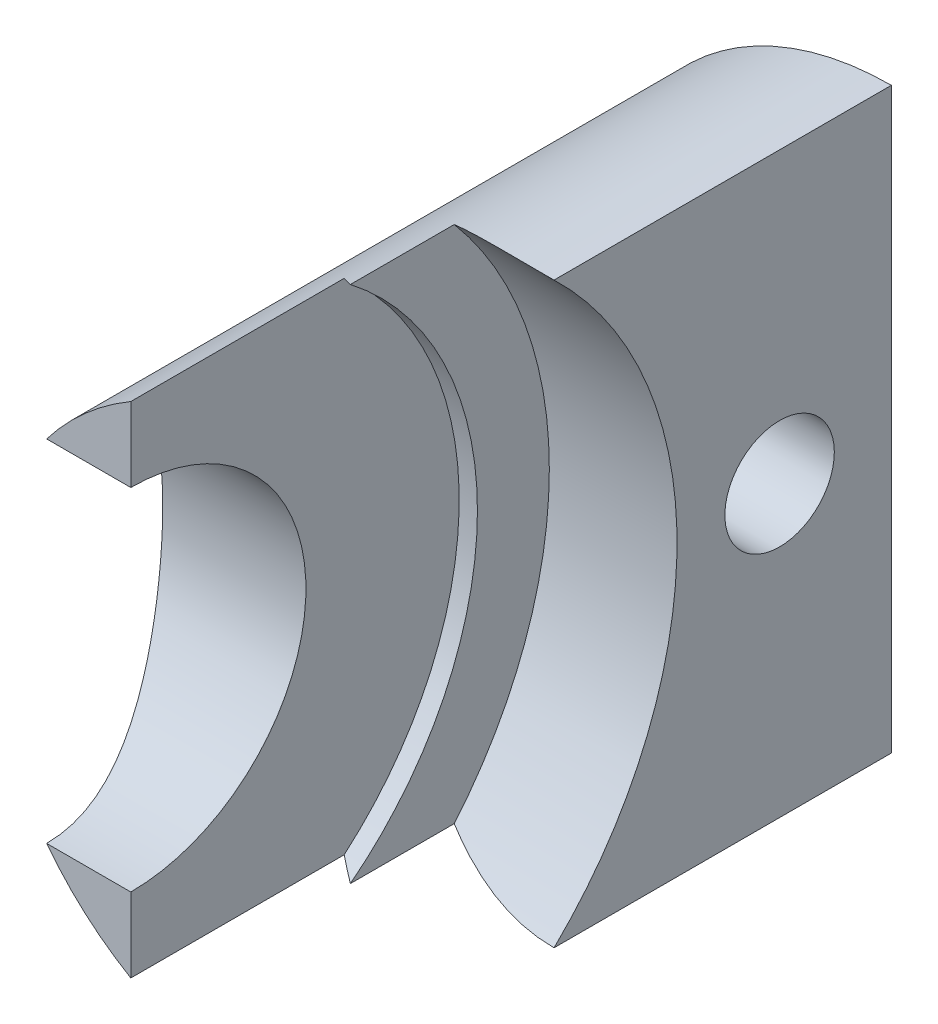
ISO-10303-21;
HEADER;
FILE_DESCRIPTION(('STEP AP214'),'2;1');
FILE_NAME('part.step','',(''),(''),'','','');
FILE_SCHEMA(('AUTOMOTIVE_DESIGN { 1 0 10303 214 1 1 1 1 }'));
ENDSEC;
DATA;
#1=APPLICATION_CONTEXT('core data for automotive mechanical design processes');
#2=APPLICATION_PROTOCOL_DEFINITION('international standard','automotive_design',2000,#1);
#3=PRODUCT_CONTEXT('',#1,'mechanical');
#4=PRODUCT('Part','Part','',(#3));
#5=PRODUCT_RELATED_PRODUCT_CATEGORY('part','',(#4));
#6=PRODUCT_DEFINITION_FORMATION('','',#4);
#7=PRODUCT_DEFINITION_CONTEXT('part definition',#1,'design');
#8=PRODUCT_DEFINITION('design','',#6,#7);
#9=PRODUCT_DEFINITION_SHAPE('','',#8);
#10=(LENGTH_UNIT() NAMED_UNIT(*) SI_UNIT(.MILLI.,.METRE.));
#11=(NAMED_UNIT(*) PLANE_ANGLE_UNIT() SI_UNIT($,.RADIAN.));
#12=(NAMED_UNIT(*) SI_UNIT($,.STERADIAN.) SOLID_ANGLE_UNIT());
#13=UNCERTAINTY_MEASURE_WITH_UNIT(LENGTH_MEASURE(1.E-05),#10,'distance_accuracy_value','');
#14=(GEOMETRIC_REPRESENTATION_CONTEXT(3) GLOBAL_UNCERTAINTY_ASSIGNED_CONTEXT((#13)) GLOBAL_UNIT_ASSIGNED_CONTEXT((#10,
#11,#12)) REPRESENTATION_CONTEXT('',''));
#15=CARTESIAN_POINT('',(0.,0.,0.));
#16=DIRECTION('',(0.,0.,1.));
#17=DIRECTION('',(1.,0.,0.));
#18=AXIS2_PLACEMENT_3D('',#15,#16,#17);
#19=CARTESIAN_POINT('',(0.,0.,16.84375));
#20=DIRECTION('',(0.,0.,1.));
#21=DIRECTION('',(1.,0.,0.));
#22=AXIS2_PLACEMENT_3D('',#19,#20,#21);
#23=PLANE('',#22);
#24=DIRECTION('',(1.,0.,0.));
#25=VECTOR('',#24,1.);
#26=CARTESIAN_POINT('',(-7.925,-4.8,16.84375));
#27=LINE('',#26,#25);
#28=CARTESIAN_POINT('',(-6.30599912781472,-4.8,16.84375));
#29=VERTEX_POINT('',#28);
#30=CARTESIAN_POINT('',(-4.,-4.8,16.84375));
#31=VERTEX_POINT('',#30);
#32=EDGE_CURVE('E99',#29,#31,#27,.T.);
#33=ORIENTED_EDGE('',*,*,#32,.F.);
#34=CARTESIAN_POINT('',(0.,0.,16.84375));
#35=DIRECTION('',(0.,0.,1.));
#36=DIRECTION('',(1.,0.,0.));
#37=AXIS2_PLACEMENT_3D('',#34,#35,#36);
#38=CIRCLE('',#37,7.925);
#39=CARTESIAN_POINT('',(-4.,-6.84146365918873,16.84375));
#40=VERTEX_POINT('',#39);
#41=EDGE_CURVE('E110',#29,#40,#38,.T.);
#42=ORIENTED_EDGE('',*,*,#41,.T.);
#43=DIRECTION('',(0.,1.,0.));
#44=VECTOR('',#43,1.);
#45=CARTESIAN_POINT('',(-4.,0.,16.84375));
#46=LINE('',#45,#44);
#47=EDGE_CURVE('E112',#40,#31,#46,.T.);
#48=ORIENTED_EDGE('',*,*,#47,.T.);
#49=EDGE_LOOP('',(#33,#42,#48));
#50=FACE_BOUND('',#49,.T.);
#51=ADVANCED_FACE('F29',(#50),#23,.T.);
#52=DIRECTION('',(1.,0.,0.));
#53=VECTOR('',#52,1.);
#54=CARTESIAN_POINT('',(-7.925,4.8,16.84375));
#55=LINE('',#54,#53);
#56=CARTESIAN_POINT('',(-4.,4.8,16.84375));
#57=VERTEX_POINT('',#56);
#58=CARTESIAN_POINT('',(-6.30599912781472,4.8,16.84375));
#59=VERTEX_POINT('',#58);
#60=EDGE_CURVE('E102',#57,#59,#55,.F.);
#61=ORIENTED_EDGE('',*,*,#60,.F.);
#62=CARTESIAN_POINT('',(-4.,6.84146365918873,16.84375));
#63=VERTEX_POINT('',#62);
#64=EDGE_CURVE('E212',#57,#63,#46,.T.);
#65=ORIENTED_EDGE('',*,*,#64,.T.);
#66=EDGE_CURVE('E117',#63,#59,#38,.T.);
#67=ORIENTED_EDGE('',*,*,#66,.T.);
#68=EDGE_LOOP('',(#61,#65,#67));
#69=FACE_BOUND('',#68,.T.);
#70=ADVANCED_FACE('F183',(#69),#23,.T.);
#71=CARTESIAN_POINT('',(0.,0.,16.84375));
#72=DIRECTION('',(0.,0.,-1.));
#73=DIRECTION('',(-1.,0.,0.));
#74=AXIS2_PLACEMENT_3D('',#71,#72,#73);
#75=CYLINDRICAL_SURFACE('',#74,7.925);
#76=CARTESIAN_POINT('',(-7.925,0.,1.5625));
#77=CARTESIAN_POINT('',(-7.92499848371948,0.0834570395977829,1.56250317336691));
#78=CARTESIAN_POINT('',(-7.92366808859329,0.166955202672544,1.569488613297));
#79=CARTESIAN_POINT('',(-7.91848912344264,0.331597599956485,1.59722723564836));
#80=CARTESIAN_POINT('',(-7.91463844543031,0.41273980423412,1.61799194337844));
#81=CARTESIAN_POINT('',(-7.90484955579841,0.570265475447111,1.67262970705467));
#82=CARTESIAN_POINT('',(-7.89891324575618,0.646653202850343,1.70649082516074));
#83=CARTESIAN_POINT('',(-7.88560092752527,0.792656462406949,1.7863261099215));
#84=CARTESIAN_POINT('',(-7.87822503160065,0.862272522005299,1.83229933212873));
#85=CARTESIAN_POINT('',(-7.86274678235363,0.993611905934744,1.93564873711105));
#86=CARTESIAN_POINT('',(-7.85463737509997,1.05524073071637,1.99314396847609));
#87=CARTESIAN_POINT('',(-7.83865829437125,1.16803861203772,2.11764924864934));
#88=CARTESIAN_POINT('',(-7.83078863835487,1.21920690838369,2.18465998837499));
#89=CARTESIAN_POINT('',(-7.81611148057603,1.31002556993215,2.32696357924578));
#90=CARTESIAN_POINT('',(-7.80931307109212,1.34957956815894,2.4023189525069));
#91=CARTESIAN_POINT('',(-7.7976476449595,1.41542987431425,2.55875545566025));
#92=CARTESIAN_POINT('',(-7.79278045843732,1.44172734836295,2.63983608121074));
#93=CARTESIAN_POINT('',(-7.78559960520081,1.48001435057426,2.80440959467139));
#94=CARTESIAN_POINT('',(-7.78325652573322,1.49216882030728,2.88786280105138));
#95=CARTESIAN_POINT('',(-7.78130052045626,1.5023368114327,3.0556543575816));
#96=CARTESIAN_POINT('',(-7.78168734509969,1.50035162536534,3.1399926261224));
#97=CARTESIAN_POINT('',(-7.78512067069891,1.48243034962562,3.30596364573442));
#98=CARTESIAN_POINT('',(-7.78813137294877,1.46668202838643,3.38761752180427));
#99=CARTESIAN_POINT('',(-7.79641697404718,1.42197732018187,3.54710290402796));
#100=CARTESIAN_POINT('',(-7.80169197076541,1.39302036229574,3.62493424479815));
#101=CARTESIAN_POINT('',(-7.81394911022026,1.32253733306208,3.77511346618336));
#102=CARTESIAN_POINT('',(-7.82094147446446,1.28093563638314,3.84742498514177));
#103=CARTESIAN_POINT('',(-7.83583875379596,1.18639751632359,3.98411159924889));
#104=CARTESIAN_POINT('',(-7.8437437631594,1.13345992146228,4.04848587305811));
#105=CARTESIAN_POINT('',(-7.85973149746342,1.01674131650945,4.16855532872357));
#106=CARTESIAN_POINT('',(-7.86781503708303,0.952799749716239,4.22409444394866));
#107=CARTESIAN_POINT('',(-7.88313235527213,0.816425008558438,4.32368159908748));
#108=CARTESIAN_POINT('',(-7.89036612501102,0.743991745965808,4.36772951959327));
#109=CARTESIAN_POINT('',(-7.90318387876219,0.59252547032848,4.44310773156422));
#110=CARTESIAN_POINT('',(-7.9087657257274,0.513484076496507,4.47442156870695));
#111=CARTESIAN_POINT('',(-7.91763423900561,0.351133850096447,4.52328374883041));
#112=CARTESIAN_POINT('',(-7.92092115384422,0.267825480662051,4.54083358238499));
#113=CARTESIAN_POINT('',(-7.92479525353875,0.100648603971151,4.56145183587511));
#114=CARTESIAN_POINT('',(-7.9254222930723,0.0168073588889621,4.56473405559083));
#115=CARTESIAN_POINT('',(-7.92401616684636,-0.150225893266153,4.55729772514609));
#116=CARTESIAN_POINT('',(-7.92198313437726,-0.23341793265924,4.54657987649854));
#117=CARTESIAN_POINT('',(-7.91551013384104,-0.39611151113508,4.51162538443318));
#118=CARTESIAN_POINT('',(-7.91108947226885,-0.475637173331645,4.48749713338365));
#119=CARTESIAN_POINT('',(-7.90033487933066,-0.629514388963665,4.42652420474412));
#120=CARTESIAN_POINT('',(-7.89400081614994,-0.703865585494564,4.38967865103103));
#121=CARTESIAN_POINT('',(-7.88002261530286,-0.846194267061441,4.30384530261995));
#122=CARTESIAN_POINT('',(-7.87236470232106,-0.91409174763786,4.2547271341029));
#123=CARTESIAN_POINT('',(-7.85662335616311,-1.04075726435733,4.14591900283076));
#124=CARTESIAN_POINT('',(-7.84853988249625,-1.0995244296714,4.08622803282614));
#125=CARTESIAN_POINT('',(-7.83272595988502,-1.20707530089407,3.95700003853142));
#126=CARTESIAN_POINT('',(-7.82500177669041,-1.25571297919608,3.88734058667665));
#127=CARTESIAN_POINT('',(-7.81090801252659,-1.34059691554051,3.74071461209814));
#128=CARTESIAN_POINT('',(-7.80453838063785,-1.37684363940793,3.66374836420479));
#129=CARTESIAN_POINT('',(-7.79392428679271,-1.43571078202909,3.50506091402016));
#130=CARTESIAN_POINT('',(-7.78966948499935,-1.45839761048839,3.42336507127201));
#131=CARTESIAN_POINT('',(-7.78374340795502,-1.48970531945365,3.25723290828082));
#132=CARTESIAN_POINT('',(-7.78207183502654,-1.498327820664,3.17279690494434));
#133=CARTESIAN_POINT('',(-7.78151677430078,-1.50120708268881,3.0050444351122));
#134=CARTESIAN_POINT('',(-7.78258857056606,-1.4956942419548,2.92173198420293));
#135=CARTESIAN_POINT('',(-7.78730022630365,-1.47096429407233,2.75724432738762));
#136=CARTESIAN_POINT('',(-7.7909400697357,-1.45174727252152,2.67606910813552));
#137=CARTESIAN_POINT('',(-7.800358708229,-1.40025245426932,2.51828725434834));
#138=CARTESIAN_POINT('',(-7.80613334053562,-1.36800006468281,2.44167206327842));
#139=CARTESIAN_POINT('',(-7.8191737643007,-1.29137540467831,2.29490360923344));
#140=CARTESIAN_POINT('',(-7.82643966385813,-1.24700225557352,2.22475081523901));
#141=CARTESIAN_POINT('',(-7.84178246925031,-1.14659661646438,2.09174537552434));
#142=CARTESIAN_POINT('',(-7.84987005399919,-1.09039662628069,2.02902038549518));
#143=CARTESIAN_POINT('',(-7.86586552302267,-0.968281413042159,1.91381446708884));
#144=CARTESIAN_POINT('',(-7.87377336559303,-0.902363961347241,1.8613358950994));
#145=CARTESIAN_POINT('',(-7.88860376027912,-0.761958024020439,1.76766070972676));
#146=CARTESIAN_POINT('',(-7.89551657723058,-0.68739625650139,1.72657234484605));
#147=CARTESIAN_POINT('',(-7.90748287021571,-0.532320313335581,1.65757167407056));
#148=CARTESIAN_POINT('',(-7.91253808199661,-0.451811779284627,1.62964706102112));
#149=CARTESIAN_POINT('',(-7.91919564162046,-0.309228461225967,1.59340037484214));
#150=CARTESIAN_POINT('',(-7.92135992219509,-0.247984316003027,1.58183265565595));
#151=CARTESIAN_POINT('',(-7.92426264826391,-0.124501059104401,1.56638138540379));
#152=CARTESIAN_POINT('',(-7.92500113120017,-0.0622619735995683,1.56249763255338));
#153=CARTESIAN_POINT('',(-7.925,0.,1.5625));
#154=B_SPLINE_CURVE_WITH_KNOTS('',3,(#76,#77,#78,#79,#80,#81,#82,#83,#84,#85,#86,#87,#88,#89,
#90,#91,#92,#93,#94,#95,#96,#97,#98,#99,#100,#101,#102,#103,#104,#105,#106,#107,#108,#109,#110,
#111,#112,#113,#114,#115,#116,#117,#118,#119,#120,#121,#122,#123,#124,#125,#126,#127,#128,#129,
#130,#131,#132,#133,#134,#135,#136,#137,#138,#139,#140,#141,#142,#143,#144,#145,#146,#147,#148,
#149,#150,#151,#152,#153),.UNSPECIFIED.,.T.,.F.,(4,2,2,2,2,2,2,2,2,2,2,2,2,2,2,2,2,2,2,2,2,2,2,
2,2,2,2,2,2,2,2,2,2,2,2,2,2,2,4),(0.,0.250143412147268,0.500496314385551,0.750621546920509,
1.000727281583,1.25356442104396,1.50641992830943,1.76131771944112,2.01619308438141,
2.26806521265155,2.5199143169749,2.76838019331623,3.01685681018847,3.26684976961555,
3.5168685764329,3.77090447122562,4.02494300566498,4.27930876041063,4.53364696479179,
4.78416048544787,5.03466145389883,5.28316653775695,5.53168874509808,5.78297250484537,
6.03428021677975,6.2889923217932,6.54369485011736,6.79713952595101,7.05055499399412,
7.29986627658862,7.54917600197427,7.79800212559833,8.04684629250405,8.29948568937352,
8.55218311793758,8.80720562481341,9.06198922891165,9.2486101731229,9.43522621651815),.UNSPECIFIED.);
#155=CARTESIAN_POINT('',(-7.925,0.,1.5625));
#156=VERTEX_POINT('',#155);
#157=EDGE_CURVE('E11',#156,#156,#154,.T.);
#158=ORIENTED_EDGE('',*,*,#157,.T.);
#159=EDGE_LOOP('',(#158));
#160=FACE_BOUND('',#159,.T.);
#161=CARTESIAN_POINT('',(-7.925,0.,12.04375));
#162=CARTESIAN_POINT('',(-7.92499911315988,0.122642132325654,12.0437509451502));
#163=CARTESIAN_POINT('',(-7.92214605061424,0.245309757695014,12.048457468869));
#164=CARTESIAN_POINT('',(-7.91080176542962,0.489716410169184,12.0672226130683));
#165=CARTESIAN_POINT('',(-7.90230743457521,0.611454887910784,12.081286389198));
#166=CARTESIAN_POINT('',(-7.87987239085095,0.853229392606028,12.1186059032133));
#167=CARTESIAN_POINT('',(-7.86592194440194,0.973261977462213,12.1418780695189));
#168=CARTESIAN_POINT('',(-7.83290995311438,1.21058258209677,12.197316044084));
#169=CARTESIAN_POINT('',(-7.81384622447643,1.32786940588064,12.2294856524794));
#170=CARTESIAN_POINT('',(-7.771169731088,1.55826609284085,12.3021297725829));
#171=CARTESIAN_POINT('',(-7.74758225969132,1.67139519702797,12.3425581855678));
#172=CARTESIAN_POINT('',(-7.69630941745201,1.89353255576294,12.4313964967494));
#173=CARTESIAN_POINT('',(-7.66862248310299,2.00253921803876,12.4798094409961));
#174=CARTESIAN_POINT('',(-7.58029693661135,2.32239330370474,12.6362879960332));
#175=CARTESIAN_POINT('',(-7.51433898906773,2.52635788004552,12.7556838208614));
#176=CARTESIAN_POINT('',(-7.36785764554834,2.92735544742974,13.0313506844277));
#177=CARTESIAN_POINT('',(-7.28660261980323,3.12263530068096,13.1897580717416));
#178=CARTESIAN_POINT('',(-7.12012718893669,3.48558959734203,13.5341678602906));
#179=CARTESIAN_POINT('',(-7.03490174428135,3.65322765995492,13.7202060256481));
#180=CARTESIAN_POINT('',(-6.85738853007434,3.97744960551398,14.1420244739208));
#181=CARTESIAN_POINT('',(-6.76555651276965,4.13000676725935,14.381117192179));
#182=CARTESIAN_POINT('',(-6.59834752799913,4.3922328686223,14.8869447715862));
#183=CARTESIAN_POINT('',(-6.52294366352691,4.50197214846326,15.1536333789816));
#184=CARTESIAN_POINT('',(-6.41654930674811,4.65186075991639,15.6403537170865));
#185=CARTESIAN_POINT('',(-6.3791997657275,4.70248078328413,15.8557643184318));
#186=CARTESIAN_POINT('',(-6.32619657490561,4.77356288645936,16.294011159372));
#187=CARTESIAN_POINT('',(-6.31051515077192,4.79406357556202,16.5168375172936));
#188=CARTESIAN_POINT('',(-6.30317543203658,4.8037127264102,16.9640462266006));
#189=CARTESIAN_POINT('',(-6.31156758300809,4.7927953522377,17.1884308610486));
#190=CARTESIAN_POINT('',(-6.35117377933606,4.74017276336672,17.6315526992633));
#191=CARTESIAN_POINT('',(-6.38240526480788,4.69844402087211,17.8502854550342));
#192=CARTESIAN_POINT('',(-6.46272125856956,4.587310012476,18.2733551079764));
#193=CARTESIAN_POINT('',(-6.51153091472183,4.51832932913485,18.4778587405431));
#194=CARTESIAN_POINT('',(-6.62171015383229,4.35525388254881,18.8729077004704));
#195=CARTESIAN_POINT('',(-6.68308429899309,4.26114999320963,19.0634479234529));
#196=CARTESIAN_POINT('',(-6.82464147519828,4.03127557803615,19.4611062627211));
#197=CARTESIAN_POINT('',(-6.90622901385975,3.89107297925623,19.6651568979971));
#198=CARTESIAN_POINT('',(-7.07174819067398,3.58145358305864,20.0490625054903));
#199=CARTESIAN_POINT('',(-7.15568204515047,3.41200832399074,20.2288935985554));
#200=CARTESIAN_POINT('',(-7.28395502440243,3.12455124141532,20.4902849471716));
#201=CARTESIAN_POINT('',(-7.32990086041053,3.01546242268114,20.5810241793141));
#202=CARTESIAN_POINT('',(-7.41903347368405,2.78897002376119,20.7529497783605));
#203=CARTESIAN_POINT('',(-7.46222130613232,2.67156966017453,20.8341398088165));
#204=CARTESIAN_POINT('',(-7.54467462745826,2.42897682652577,20.9862825159124));
#205=CARTESIAN_POINT('',(-7.58393950792854,2.30378315267717,21.0572336053592));
#206=CARTESIAN_POINT('',(-7.65739944252727,2.04639925905587,21.1880647681574));
#207=CARTESIAN_POINT('',(-7.6915976206669,1.91421341930147,21.2479516691051));
#208=CARTESIAN_POINT('',(-7.75201570538621,1.65192992849052,21.3526117714748));
#209=CARTESIAN_POINT('',(-7.77859414594751,1.52219349586455,21.3980822460144));
#210=CARTESIAN_POINT('',(-7.82560959482879,1.25833264678613,21.4779254882188));
#211=CARTESIAN_POINT('',(-7.84605006547379,1.12421075162769,21.5123045131999));
#212=CARTESIAN_POINT('',(-7.88017166955357,0.852769256652923,21.5694251017779));
#213=CARTESIAN_POINT('',(-7.89385799055088,0.715452196056142,21.5921755972135));
#214=CARTESIAN_POINT('',(-7.91405447631498,0.438845617699454,21.6256757373104));
#215=CARTESIAN_POINT('',(-7.92056569646099,0.299556393076937,21.6364271469094));
#216=CARTESIAN_POINT('',(-7.92581175388947,0.0398466955955401,21.6450907721343));
#217=CARTESIAN_POINT('',(-7.92550171427004,-0.0805052961529175,21.6445799228681));
#218=CARTESIAN_POINT('',(-7.91941885946609,-0.320732803360764,21.6345314114327));
#219=CARTESIAN_POINT('',(-7.9136443613749,-0.440608160607944,21.6249909683906));
#220=CARTESIAN_POINT('',(-7.89677096548462,-0.67888601240624,21.597011263222));
#221=CARTESIAN_POINT('',(-7.88567434398708,-0.797289114457855,21.5785758055221));
#222=CARTESIAN_POINT('',(-7.85842832984379,-1.03184483931372,21.5330564621045));
#223=CARTESIAN_POINT('',(-7.84227698911594,-1.14799657608586,21.505969241926));
#224=CARTESIAN_POINT('',(-7.78779420336551,-1.48548202568029,21.4139328142593));
#225=CARTESIAN_POINT('',(-7.74290888525803,-1.70272275454459,21.3373660807301));
#226=CARTESIAN_POINT('',(-7.63893679407907,-2.12106117846169,21.1557387531171));
#227=CARTESIAN_POINT('',(-7.57984732722901,-2.32215580178728,21.0506727537382));
#228=CARTESIAN_POINT('',(-7.44505260367053,-2.72515113814113,20.8029296207868));
#229=CARTESIAN_POINT('',(-7.36826130622406,-2.92498771847969,20.6574878026072));
#230=CARTESIAN_POINT('',(-7.20862847576037,-3.29890049865134,20.3391308657971));
#231=CARTESIAN_POINT('',(-7.12578000105746,-3.47294642810157,20.1661839502572));
#232=CARTESIAN_POINT('',(-6.9496605911384,-3.81437387271958,19.7707991822563));
#233=CARTESIAN_POINT('',(-6.85647895076537,-3.97774498700513,19.5448354425571));
#234=CARTESIAN_POINT('',(-6.68194810038016,-4.26443269225748,19.0647075583233));
#235=CARTESIAN_POINT('',(-6.60058733144386,-4.38778855927915,18.8105713966215));
#236=CARTESIAN_POINT('',(-6.47701034335335,-4.56763297882269,18.3358661848459));
#237=CARTESIAN_POINT('',(-6.43013771377633,-4.63279999265059,18.1198502617728));
#238=CARTESIAN_POINT('',(-6.37540904395641,-4.7075155711577,17.7882958642013));
#239=CARTESIAN_POINT('',(-6.3597640585489,-4.72858015782702,17.6765401675925));
#240=CARTESIAN_POINT('',(-6.3342015877038,-4.76277044010843,17.4511903147469));
#241=CARTESIAN_POINT('',(-6.3242818722931,-4.77589922678187,17.3375968920451));
#242=CARTESIAN_POINT('',(-6.31053346237829,-4.79405069242927,17.1088885012323));
#243=CARTESIAN_POINT('',(-6.30673192746871,-4.79903722804926,16.9937690234614));
#244=CARTESIAN_POINT('',(-6.30545894414935,-4.80070971779676,16.7634344608166));
#245=CARTESIAN_POINT('',(-6.3079875008376,-4.79739566523926,16.6482193758658));
#246=CARTESIAN_POINT('',(-6.31927444071069,-4.78251852330518,16.4186002403118));
#247=CARTESIAN_POINT('',(-6.32803439879913,-4.77095334856533,16.3041964021244));
#248=CARTESIAN_POINT('',(-6.35142554240473,-4.73976668740736,16.0770859995299));
#249=CARTESIAN_POINT('',(-6.36605902669665,-4.72014204661376,15.9643801176074));
#250=CARTESIAN_POINT('',(-6.41605639108533,-4.65219763015593,15.6423988470319));
#251=CARTESIAN_POINT('',(-6.45829163128839,-4.59386922537816,15.4362055370014));
#252=CARTESIAN_POINT('',(-6.55697172323092,-4.4518711955014,15.036550250709));
#253=CARTESIAN_POINT('',(-6.61342198191184,-4.36819192527342,14.8430931542987));
#254=CARTESIAN_POINT('',(-6.7446298424366,-4.16323441346624,14.442615581089));
#255=CARTESIAN_POINT('',(-6.82086624447041,-4.03817111850311,14.2380155526884));
#256=CARTESIAN_POINT('',(-6.97800270259854,-3.76014382250235,13.8507091978989));
#257=CARTESIAN_POINT('',(-7.05890658212365,-3.60715671880079,13.6680212093083));
#258=CARTESIAN_POINT('',(-7.23262165495172,-3.24672263596931,13.2974291740149));
#259=CARTESIAN_POINT('',(-7.32509987055307,-3.03443605803739,13.1139875734066));
#260=CARTESIAN_POINT('',(-7.45470130076703,-2.69222153941202,12.867345510498));
#261=CARTESIAN_POINT('',(-7.49641408727295,-2.57407515767851,12.7898310576172));
#262=CARTESIAN_POINT('',(-7.57570261156021,-2.33039201647475,12.645020775318));
#263=CARTESIAN_POINT('',(-7.61328064866461,-2.2048594246794,12.5777192585369));
#264=CARTESIAN_POINT('',(-7.68242553821368,-1.95012330982817,12.4555257579139));
#265=CARTESIAN_POINT('',(-7.71411209461399,-1.82107356842645,12.4003810732903));
#266=CARTESIAN_POINT('',(-7.77160539029867,-1.55754360381442,12.3012997642531));
#267=CARTESIAN_POINT('',(-7.79741555813074,-1.42306660131214,12.257356602571));
#268=CARTESIAN_POINT('',(-7.84231756975939,-1.15011194547419,12.1814271449103));
#269=CARTESIAN_POINT('',(-7.86142871058781,-1.01164704751033,12.1494064884358));
#270=CARTESIAN_POINT('',(-7.89240247857492,-0.731712613708138,12.0977176117172));
#271=CARTESIAN_POINT('',(-7.90427098982073,-0.590245613807051,12.0780393638401));
#272=CARTESIAN_POINT('',(-7.91653876824408,-0.373636633143919,12.0577300765501));
#273=CARTESIAN_POINT('',(-7.91970844032989,-0.299048272265573,12.0524908795744));
#274=CARTESIAN_POINT('',(-7.92393937331244,-0.149643110775774,12.0455004759379));
#275=CARTESIAN_POINT('',(-7.92500054107805,-0.0748263002200344,12.0437494233459));
#276=CARTESIAN_POINT('',(-7.925,0.,12.04375));
#277=B_SPLINE_CURVE_WITH_KNOTS('',3,(#161,#162,#163,#164,#165,#166,#167,#168,#169,#170,#171,
#172,#173,#174,#175,#176,#177,#178,#179,#180,#181,#182,#183,#184,#185,#186,#187,#188,#189,#190,
#191,#192,#193,#194,#195,#196,#197,#198,#199,#200,#201,#202,#203,#204,#205,#206,#207,#208,#209,
#210,#211,#212,#213,#214,#215,#216,#217,#218,#219,#220,#221,#222,#223,#224,#225,#226,#227,#228,
#229,#230,#231,#232,#233,#234,#235,#236,#237,#238,#239,#240,#241,#242,#243,#244,#245,#246,#247,
#248,#249,#250,#251,#252,#253,#254,#255,#256,#257,#258,#259,#260,#261,#262,#263,#264,#265,#266,
#267,#268,#269,#270,#271,#272,#273,#274,#275,#276),.UNSPECIFIED.,.T.,.F.,(4,2,2,2,2,2,2,2,2,2,2,
2,2,2,2,2,2,2,2,2,2,2,2,2,2,2,2,2,2,2,2,2,2,2,2,2,2,2,2,2,2,2,2,2,2,2,2,2,2,2,2,2,2,2,2,2,2,4),
(0.,0.367848111429016,0.735899067453033,1.1046096346776,1.47347792360068,1.84034093139371,
2.20734422030129,2.94045454194068,3.73020719806882,4.52099113227314,5.41100476041229,
6.29955007618031,6.96993639733762,7.63946261332169,8.31039282891834,8.98183590248017,
9.64320626824115,10.3048172068093,11.0839527841129,11.8638510093013,12.3108138380761,
12.7576046262738,13.2044645996738,13.6510478925789,14.0704937153371,14.4897024894139,
14.9085887847781,15.3274134583017,15.6880208588677,16.0487393529983,16.409303703234,
16.7700071859733,17.4708279884298,18.171781804667,18.9451706958693,19.7194602405853,
20.5973912475813,21.4744579155361,22.1626935678251,22.5067070526148,22.8505864547449,
23.1959882240744,23.5413902715786,23.8868796458735,24.2325043695063,24.8849178657193,
25.5375798951369,26.2896259163447,27.0422969839584,27.9238378427924,28.3653608581742,
28.8066370894684,29.2376270167244,29.6683648371035,30.097851487848,30.5269887471171,
30.7514099719681,30.9758411091247),.UNSPECIFIED.);
#278=EDGE_CURVE('E41',#29,#59,#277,.T.);
#279=ORIENTED_EDGE('',*,*,#278,.T.);
#280=ORIENTED_EDGE('',*,*,#66,.F.);
#281=DIRECTION('',(0.,0.,-1.));
#282=VECTOR('',#281,1.);
#283=CARTESIAN_POINT('',(-4.,6.84146365918873,16.84375));
#284=LINE('',#283,#282);
#285=CARTESIAN_POINT('',(-4.,6.84146365918873,10.9961543402438));
#286=VERTEX_POINT('',#285);
#287=EDGE_CURVE('E157',#286,#63,#284,.F.);
#288=ORIENTED_EDGE('',*,*,#287,.F.);
#289=CARTESIAN_POINT('',(-4.,6.84146365918873,10.9961543402438));
#290=CARTESIAN_POINT('',(-3.8710375308379,6.91683585802271,11.0843079100545));
#291=CARTESIAN_POINT('',(-3.73968192012294,6.98877030195516,11.1719485258962));
#292=CARTESIAN_POINT('',(-3.47169431467644,7.1257099619526,11.3449898643057));
#293=CARTESIAN_POINT('',(-3.33505558927621,7.19070591372915,11.4303874801583));
#294=CARTESIAN_POINT('',(-3.05329813139729,7.31486013640419,11.599319174863));
#295=CARTESIAN_POINT('',(-2.90805921616113,7.37385937580257,11.682771475941));
#296=CARTESIAN_POINT('',(-2.61161391782818,7.48399068640011,11.8438087077917));
#297=CARTESIAN_POINT('',(-2.46041056390043,7.53512668808946,11.9213965600206));
#298=CARTESIAN_POINT('',(-2.06543508593223,7.65523996885638,12.1092398186067));
#299=CARTESIAN_POINT('',(-1.81688739321352,7.71835471135747,12.2137084807187));
#300=CARTESIAN_POINT('',(-1.43336981414385,7.79537400284123,12.3454432324662));
#301=CARTESIAN_POINT('',(-1.30435857987584,7.81804130063197,12.3850689928507));
#302=CARTESIAN_POINT('',(-1.0428230364425,7.85720155138219,12.4544503579904));
#303=CARTESIAN_POINT('',(-0.91030121853407,7.8736987635216,12.4842127697443));
#304=CARTESIAN_POINT('',(-0.649200770697978,7.89939554732054,12.5309465641994));
#305=CARTESIAN_POINT('',(-0.520757071312494,7.90891923379852,12.5484839191905));
#306=CARTESIAN_POINT('',(-0.261579471184321,7.92176150231718,12.5722462411869));
#307=CARTESIAN_POINT('',(-0.130835677162662,7.92503397577123,12.5783871392079));
#308=CARTESIAN_POINT('',(0.,7.925,12.5782635095748));
#309=B_SPLINE_CURVE_WITH_KNOTS('',3,(#289,#290,#291,#292,#293,#294,#295,#296,#297,#298,#299,
#300,#301,#302,#303,#304,#305,#306,#307,#308),.UNSPECIFIED.,.F.,.F.,(4,2,2,2,2,2,2,2,2,4),(0.,
0.520318571235694,1.04132340525585,1.57373905985674,2.10588771184019,2.93356034268161,
3.34368278148986,3.75352158996488,4.14283392149501,4.53500687499044),.UNSPECIFIED.);
#310=CARTESIAN_POINT('',(-3.5,7.11024788597416,11.3261078405264));
#311=VERTEX_POINT('',#310);
#312=EDGE_CURVE('E152',#286,#311,#309,.T.);
#313=ORIENTED_EDGE('',*,*,#312,.T.);
#314=DIRECTION('',(0.,0.,-1.));
#315=VECTOR('',#314,1.);
#316=CARTESIAN_POINT('',(-3.5,7.11024788597416,16.84375));
#317=LINE('',#316,#315);
#318=CARTESIAN_POINT('',(-3.5,7.11024788597416,8.47999143399277));
#319=VERTEX_POINT('',#318);
#320=EDGE_CURVE('E131',#319,#311,#317,.F.);
#321=ORIENTED_EDGE('',*,*,#320,.F.);
#322=CARTESIAN_POINT('',(-3.5,7.11024788597416,8.47999143399277));
#323=CARTESIAN_POINT('',(-3.3446296778348,7.18672378833649,8.54476911958082));
#324=CARTESIAN_POINT('',(-3.18595313717724,7.25850922571666,8.6073879770616));
#325=CARTESIAN_POINT('',(-2.86204471174049,7.39223212651783,8.72676240687647));
#326=CARTESIAN_POINT('',(-2.69680262045428,7.45415344235371,8.78350831305784));
#327=CARTESIAN_POINT('',(-2.36454979065137,7.56600741503053,8.88804163950102));
#328=CARTESIAN_POINT('',(-2.19768762087351,7.6162020392652,8.93601821068577));
#329=CARTESIAN_POINT('',(-1.85886631164026,7.70590193536661,9.02307502260624));
#330=CARTESIAN_POINT('',(-1.68690906849513,7.74541113009359,9.06215852734718));
#331=CARTESIAN_POINT('',(-1.39084982988821,7.80298768897235,9.119751653518));
#332=CARTESIAN_POINT('',(-1.26781574717591,7.8239338604331,9.14091858429086));
#333=CARTESIAN_POINT('',(-1.02007881343877,7.86007195696841,9.1776574677934));
#334=CARTESIAN_POINT('',(-0.895376142102233,7.87526449656277,9.19323001802481));
#335=CARTESIAN_POINT('',(-0.642591273749006,7.89994265057889,9.21861438155248));
#336=CARTESIAN_POINT('',(-0.514488140343063,7.90932364553675,9.22832051627273));
#337=CARTESIAN_POINT('',(-0.257594505132995,7.92186040512243,9.24132115527797));
#338=CARTESIAN_POINT('',(-0.128803706056938,7.92501321422822,9.2446126155347));
#339=CARTESIAN_POINT('',(0.,7.925,9.2445823957464));
#340=B_SPLINE_CURVE_WITH_KNOTS('',3,(#322,#323,#324,#325,#326,#327,#328,#329,#330,#331,#332,
#333,#334,#335,#336,#337,#338,#339),.UNSPECIFIED.,.F.,.F.,(4,2,2,2,2,2,2,2,4),(0.,
0.554697210506613,1.11029333168667,1.65194004206452,2.19338763105646,2.57290810062746,
2.95238802386769,3.33851465807195,3.7248244807558),.UNSPECIFIED.);
#341=CARTESIAN_POINT('',(0.,7.925,9.2445823957464));
#342=VERTEX_POINT('',#341);
#343=EDGE_CURVE('E120',#319,#342,#340,.T.);
#344=ORIENTED_EDGE('',*,*,#343,.T.);
#345=DIRECTION('',(0.,0.,1.));
#346=VECTOR('',#345,1.);
#347=CARTESIAN_POINT('',(0.,7.925,0.));
#348=LINE('',#347,#346);
#349=CARTESIAN_POINT('',(0.,7.925,0.));
#350=VERTEX_POINT('',#349);
#351=EDGE_CURVE('E203',#350,#342,#348,.T.);
#352=ORIENTED_EDGE('',*,*,#351,.F.);
#353=CARTESIAN_POINT('',(0.,0.,0.));
#354=DIRECTION('',(0.,0.,1.));
#355=DIRECTION('',(1.,0.,0.));
#356=AXIS2_PLACEMENT_3D('',#353,#354,#355);
#357=CIRCLE('',#356,7.925);
#358=CARTESIAN_POINT('',(0.,-7.925,0.));
#359=VERTEX_POINT('',#358);
#360=EDGE_CURVE('E118',#350,#359,#357,.T.);
#361=ORIENTED_EDGE('',*,*,#360,.T.);
#362=DIRECTION('',(0.,0.,1.));
#363=VECTOR('',#362,1.);
#364=CARTESIAN_POINT('',(0.,-7.925,0.));
#365=LINE('',#364,#363);
#366=CARTESIAN_POINT('',(0.,-7.925,9.2445823957464));
#367=VERTEX_POINT('',#366);
#368=EDGE_CURVE('E201',#359,#367,#365,.T.);
#369=ORIENTED_EDGE('',*,*,#368,.T.);
#370=CARTESIAN_POINT('',(0.,-7.925,9.2445823957464));
#371=CARTESIAN_POINT('',(-0.0922840670025632,-7.92500166520478,9.2445875645996));
#372=CARTESIAN_POINT('',(-0.184551697523259,-7.92338756357451,9.2429069146524));
#373=CARTESIAN_POINT('',(-0.368843991166695,-7.91694870850191,9.23622493516293));
#374=CARTESIAN_POINT('',(-0.460868681266848,-7.91212432802054,9.23122399136298));
#375=CARTESIAN_POINT('',(-0.735992361334712,-7.8928877102182,9.21133845131723));
#376=CARTESIAN_POINT('',(-0.918446902704304,-7.87371184805328,9.1915708105935));
#377=CARTESIAN_POINT('',(-1.27572520560316,-7.8236804350543,9.14062592739652));
#378=CARTESIAN_POINT('',(-1.45062807029244,-7.79310171572967,9.10971965511844));
#379=CARTESIAN_POINT('',(-1.79601997786856,-7.72082030452736,9.03783173456742));
#380=CARTESIAN_POINT('',(-1.96650846931639,-7.67911623016636,8.99684883417999));
#381=CARTESIAN_POINT('',(-2.25292376426779,-7.59902170285333,8.91968025653906));
#382=CARTESIAN_POINT('',(-2.3701763671405,-7.56325201895691,8.88561771254225));
#383=CARTESIAN_POINT('',(-2.60186805305656,-7.48670725961084,8.81382779995086));
#384=CARTESIAN_POINT('',(-2.71630765546689,-7.4459331165986,8.77610111433652));
#385=CARTESIAN_POINT('',(-2.94416069912278,-7.35884997334453,8.69686943405601));
#386=CARTESIAN_POINT('',(-3.05752429789647,-7.31245923662192,8.65531145571157));
#387=CARTESIAN_POINT('',(-3.28112438753171,-7.21489540373504,8.56952179374578));
#388=CARTESIAN_POINT('',(-3.39136124604611,-7.16372287289473,8.52529042640162));
#389=CARTESIAN_POINT('',(-3.5,-7.11024788597416,8.47999143399277));
#390=B_SPLINE_CURVE_WITH_KNOTS('',3,(#370,#371,#372,#373,#374,#375,#376,#377,#378,#379,#380,
#381,#382,#383,#384,#385,#386,#387,#388,#389),.UNSPECIFIED.,.F.,.F.,(4,2,2,2,2,2,2,2,2,4),(0.,
0.27679084977297,0.553549548394885,1.10615326434793,1.64613269322398,2.18617925349155,
2.56770086773195,2.94915150396842,3.33703424425274,3.72487118527409),.UNSPECIFIED.);
#391=CARTESIAN_POINT('',(-3.5,-7.11024788597416,8.47999143399277));
#392=VERTEX_POINT('',#391);
#393=EDGE_CURVE('E144',#367,#392,#390,.T.);
#394=ORIENTED_EDGE('',*,*,#393,.T.);
#395=DIRECTION('',(0.,0.,-1.));
#396=VECTOR('',#395,1.);
#397=CARTESIAN_POINT('',(-3.5,-7.11024788597416,16.84375));
#398=LINE('',#397,#396);
#399=CARTESIAN_POINT('',(-3.5,-7.11024788597416,11.3261078405264));
#400=VERTEX_POINT('',#399);
#401=EDGE_CURVE('E150',#400,#392,#398,.T.);
#402=ORIENTED_EDGE('',*,*,#401,.F.);
#403=CARTESIAN_POINT('',(0.,-7.925,12.5782635095748));
#404=CARTESIAN_POINT('',(-0.127225522939726,-7.9250313627186,12.5783763116475));
#405=CARTESIAN_POINT('',(-0.254375373469212,-7.92193784531799,12.5725740252253));
#406=CARTESIAN_POINT('',(-0.507119674414117,-7.90975903243337,12.5500340667349));
#407=CARTESIAN_POINT('',(-0.632717103769197,-7.90068799793727,12.5333224227832));
#408=CARTESIAN_POINT('',(-0.879724720788446,-7.87698679115225,12.4901727514072));
#409=CARTESIAN_POINT('',(-1.00116937490064,-7.86244095739415,12.4638824689253));
#410=CARTESIAN_POINT('',(-1.24121300142793,-7.82813651064586,12.4028591323285));
#411=CARTESIAN_POINT('',(-1.35981006352655,-7.80837449939256,12.3681205754512));
#412=CARTESIAN_POINT('',(-1.64771234742609,-7.75376959406761,12.2739344845237));
#413=CARTESIAN_POINT('',(-1.81518322755525,-7.71617460023344,12.2104795886377));
#414=CARTESIAN_POINT('',(-2.14303382917544,-7.63162712418413,12.0725011664779));
#415=CARTESIAN_POINT('',(-2.30340937722578,-7.58466922186313,11.9979712353587));
#416=CARTESIAN_POINT('',(-2.61854246366497,-7.48174679240173,11.8405131284913));
#417=CARTESIAN_POINT('',(-2.77324968711111,-7.42571822977353,11.7575269239629));
#418=CARTESIAN_POINT('',(-3.07622895955031,-7.30540866438822,11.5861874808307));
#419=CARTESIAN_POINT('',(-3.22450346734433,-7.24113085262908,11.4978363244389));
#420=CARTESIAN_POINT('',(-3.47845800643838,-7.12182315072728,11.3404073486616));
#421=CARTESIAN_POINT('',(-3.58544624231753,-7.06855157877795,11.2720908259649));
#422=CARTESIAN_POINT('',(-3.79543769263556,-6.95803224300398,11.1346757609711));
#423=CARTESIAN_POINT('',(-3.89846523354454,-6.90081822384008,11.0655872790556));
#424=CARTESIAN_POINT('',(-4.,-6.84146365918873,10.9961543402438));
#425=B_SPLINE_CURVE_WITH_KNOTS('',3,(#403,#404,#405,#406,#407,#408,#409,#410,#411,#412,#413,
#414,#415,#416,#417,#418,#419,#420,#421,#422,#423,#424),.UNSPECIFIED.,.F.,.F.,(4,2,2,2,2,2,2,2,
2,2,4),(0.,0.381385864761314,0.761865108484156,1.1367082732645,1.51179624821419,
2.05984094599952,2.6082038280177,3.1606218164908,3.71282675753967,4.12571167636925,
4.53542000590807),.UNSPECIFIED.);
#426=CARTESIAN_POINT('',(-4.,-6.84146365918873,10.9961543402438));
#427=VERTEX_POINT('',#426);
#428=EDGE_CURVE('E165',#400,#427,#425,.T.);
#429=ORIENTED_EDGE('',*,*,#428,.T.);
#430=DIRECTION('',(0.,0.,-1.));
#431=VECTOR('',#430,1.);
#432=CARTESIAN_POINT('',(-4.,-6.84146365918873,16.84375));
#433=LINE('',#432,#431);
#434=EDGE_CURVE('E107',#40,#427,#433,.T.);
#435=ORIENTED_EDGE('',*,*,#434,.F.);
#436=ORIENTED_EDGE('',*,*,#41,.F.);
#437=EDGE_LOOP('',(#279,#280,#288,#313,#321,#344,#352,#361,#369,#394,#402,#429,#435,#436));
#438=FACE_BOUND('',#437,.T.);
#439=ADVANCED_FACE('F31',(#160,#438),#75,.T.);
#440=CARTESIAN_POINT('',(0.,0.,0.));
#441=DIRECTION('',(0.,0.,1.));
#442=DIRECTION('',(1.,0.,0.));
#443=AXIS2_PLACEMENT_3D('',#440,#441,#442);
#444=PLANE('',#443);
#445=ORIENTED_EDGE('',*,*,#360,.F.);
#446=DIRECTION('',(0.,1.,0.));
#447=VECTOR('',#446,1.);
#448=CARTESIAN_POINT('',(0.,-7.925,0.));
#449=LINE('',#448,#447);
#450=EDGE_CURVE('E122',#359,#350,#449,.T.);
#451=ORIENTED_EDGE('',*,*,#450,.F.);
#452=EDGE_LOOP('',(#445,#451));
#453=FACE_BOUND('',#452,.T.);
#454=ADVANCED_FACE('F188',(#453),#444,.F.);
#455=CARTESIAN_POINT('',(0.,-7.925,0.));
#456=DIRECTION('',(-1.,0.,0.));
#457=DIRECTION('',(0.,0.,1.));
#458=AXIS2_PLACEMENT_3D('',#455,#456,#457);
#459=PLANE('',#458);
#460=CARTESIAN_POINT('',(0.,0.,3.0625));
#461=DIRECTION('',(1.,0.,0.));
#462=DIRECTION('',(0.,0.,-1.));
#463=AXIS2_PLACEMENT_3D('',#460,#461,#462);
#464=CIRCLE('',#463,1.5);
#465=CARTESIAN_POINT('',(0.,0.,1.5625));
#466=VERTEX_POINT('',#465);
#467=EDGE_CURVE('E221',#466,#466,#464,.T.);
#468=ORIENTED_EDGE('',*,*,#467,.F.);
#469=EDGE_LOOP('',(#468));
#470=FACE_BOUND('',#469,.T.);
#471=ORIENTED_EDGE('',*,*,#351,.T.);
#472=CARTESIAN_POINT('',(0.,0.,16.873106171681));
#473=DIRECTION('',(1.,0.,0.));
#474=DIRECTION('',(0.,0.,-1.));
#475=AXIS2_PLACEMENT_3D('',#472,#473,#474);
#476=CIRCLE('',#475,11.);
#477=EDGE_CURVE('E56',#367,#342,#476,.T.);
#478=ORIENTED_EDGE('',*,*,#477,.F.);
#479=ORIENTED_EDGE('',*,*,#368,.F.);
#480=ORIENTED_EDGE('',*,*,#450,.T.);
#481=EDGE_LOOP('',(#471,#478,#479,#480));
#482=FACE_BOUND('',#481,.T.);
#483=ADVANCED_FACE('F141',(#470,#482),#459,.F.);
#484=CARTESIAN_POINT('',(-3.5,0.,16.873106171681));
#485=DIRECTION('',(1.,0.,0.));
#486=DIRECTION('',(0.,0.,-1.));
#487=AXIS2_PLACEMENT_3D('',#484,#485,#486);
#488=PLANE('',#487);
#489=CARTESIAN_POINT('',(-3.5,0.,16.84375));
#490=DIRECTION('',(1.,0.,0.));
#491=DIRECTION('',(0.,0.,-1.));
#492=AXIS2_PLACEMENT_3D('',#489,#490,#491);
#493=CIRCLE('',#492,9.);
#494=EDGE_CURVE('E48',#400,#311,#493,.T.);
#495=ORIENTED_EDGE('',*,*,#494,.F.);
#496=ORIENTED_EDGE('',*,*,#401,.T.);
#497=CARTESIAN_POINT('',(-3.5,0.,16.873106171681));
#498=DIRECTION('',(1.,0.,0.));
#499=DIRECTION('',(0.,0.,-1.));
#500=AXIS2_PLACEMENT_3D('',#497,#498,#499);
#501=CIRCLE('',#500,11.);
#502=EDGE_CURVE('E206',#392,#319,#501,.T.);
#503=ORIENTED_EDGE('',*,*,#502,.T.);
#504=ORIENTED_EDGE('',*,*,#320,.T.);
#505=EDGE_LOOP('',(#495,#496,#503,#504));
#506=FACE_BOUND('',#505,.T.);
#507=ADVANCED_FACE('F139',(#506),#488,.T.);
#508=CARTESIAN_POINT('',(-3.5,0.,16.873106171681));
#509=DIRECTION('',(1.,0.,0.));
#510=DIRECTION('',(0.,0.,-1.));
#511=AXIS2_PLACEMENT_3D('',#508,#509,#510);
#512=CYLINDRICAL_SURFACE('',#511,11.);
#513=ORIENTED_EDGE('',*,*,#477,.T.);
#514=ORIENTED_EDGE('',*,*,#343,.F.);
#515=ORIENTED_EDGE('',*,*,#502,.F.);
#516=ORIENTED_EDGE('',*,*,#393,.F.);
#517=EDGE_LOOP('',(#513,#514,#515,#516));
#518=FACE_BOUND('',#517,.T.);
#519=ADVANCED_FACE('F133',(#518),#512,.F.);
#520=CARTESIAN_POINT('',(-4.,0.,16.84375));
#521=DIRECTION('',(1.,0.,0.));
#522=DIRECTION('',(0.,0.,-1.));
#523=AXIS2_PLACEMENT_3D('',#520,#521,#522);
#524=PLANE('',#523);
#525=CARTESIAN_POINT('',(-4.,0.,16.84375));
#526=DIRECTION('',(1.,0.,0.));
#527=DIRECTION('',(0.,0.,-1.));
#528=AXIS2_PLACEMENT_3D('',#525,#526,#527);
#529=CIRCLE('',#528,4.8);
#530=EDGE_CURVE('E113',#31,#57,#529,.T.);
#531=ORIENTED_EDGE('',*,*,#530,.F.);
#532=ORIENTED_EDGE('',*,*,#47,.F.);
#533=ORIENTED_EDGE('',*,*,#434,.T.);
#534=CARTESIAN_POINT('',(-4.,0.,16.84375));
#535=DIRECTION('',(1.,0.,0.));
#536=DIRECTION('',(0.,0.,-1.));
#537=AXIS2_PLACEMENT_3D('',#534,#535,#536);
#538=CIRCLE('',#537,9.);
#539=EDGE_CURVE('E216',#427,#286,#538,.T.);
#540=ORIENTED_EDGE('',*,*,#539,.T.);
#541=ORIENTED_EDGE('',*,*,#287,.T.);
#542=ORIENTED_EDGE('',*,*,#64,.F.);
#543=EDGE_LOOP('',(#531,#532,#533,#540,#541,#542));
#544=FACE_BOUND('',#543,.T.);
#545=ADVANCED_FACE('F138',(#544),#524,.T.);
#546=CARTESIAN_POINT('',(-4.,0.,16.84375));
#547=DIRECTION('',(1.,0.,0.));
#548=DIRECTION('',(0.,0.,-1.));
#549=AXIS2_PLACEMENT_3D('',#546,#547,#548);
#550=CYLINDRICAL_SURFACE('',#549,9.);
#551=ORIENTED_EDGE('',*,*,#494,.T.);
#552=ORIENTED_EDGE('',*,*,#312,.F.);
#553=ORIENTED_EDGE('',*,*,#539,.F.);
#554=ORIENTED_EDGE('',*,*,#428,.F.);
#555=EDGE_LOOP('',(#551,#552,#553,#554));
#556=FACE_BOUND('',#555,.T.);
#557=ADVANCED_FACE('F159',(#556),#550,.F.);
#558=CARTESIAN_POINT('',(-7.925,0.,16.84375));
#559=DIRECTION('',(1.,0.,0.));
#560=DIRECTION('',(0.,0.,-1.));
#561=AXIS2_PLACEMENT_3D('',#558,#559,#560);
#562=CYLINDRICAL_SURFACE('',#561,4.8);
#563=ORIENTED_EDGE('',*,*,#530,.T.);
#564=ORIENTED_EDGE('',*,*,#60,.T.);
#565=ORIENTED_EDGE('',*,*,#278,.F.);
#566=ORIENTED_EDGE('',*,*,#32,.T.);
#567=EDGE_LOOP('',(#563,#564,#565,#566));
#568=FACE_BOUND('',#567,.T.);
#569=ADVANCED_FACE('F98',(#568),#562,.F.);
#570=CARTESIAN_POINT('',(-7.925,0.,3.0625));
#571=DIRECTION('',(1.,0.,0.));
#572=DIRECTION('',(0.,0.,-1.));
#573=AXIS2_PLACEMENT_3D('',#570,#571,#572);
#574=CYLINDRICAL_SURFACE('',#573,1.5);
#575=ORIENTED_EDGE('',*,*,#467,.T.);
#576=EDGE_LOOP('',(#575));
#577=FACE_BOUND('',#576,.T.);
#578=ORIENTED_EDGE('',*,*,#157,.F.);
#579=EDGE_LOOP('',(#578));
#580=FACE_BOUND('',#579,.T.);
#581=ADVANCED_FACE('F174',(#577,#580),#574,.F.);
#582=CLOSED_SHELL('',(#51,#70,#439,#454,#483,#507,#519,#545,#557,#569,#581));
#583=MANIFOLD_SOLID_BREP('B2',#582);
#584=ADVANCED_BREP_SHAPE_REPRESENTATION('',(#18,#583),#14);
#585=SHAPE_DEFINITION_REPRESENTATION(#9,#584);
ENDSEC;
END-ISO-10303-21;
